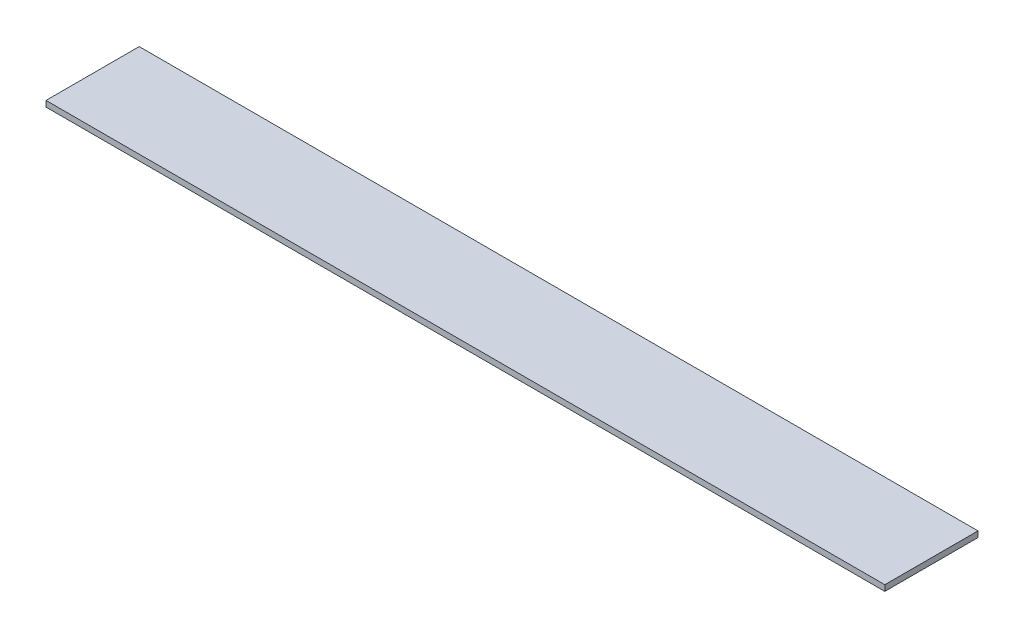
ISO-10303-21;
HEADER;
FILE_DESCRIPTION(('STEP AP214'),'2;1');
FILE_NAME('part.step','',(''),(''),'','','');
FILE_SCHEMA(('AUTOMOTIVE_DESIGN { 1 0 10303 214 1 1 1 1 }'));
ENDSEC;
DATA;
#1=APPLICATION_CONTEXT('core data for automotive mechanical design processes');
#2=APPLICATION_PROTOCOL_DEFINITION('international standard','automotive_design',2000,#1);
#3=PRODUCT_CONTEXT('',#1,'mechanical');
#4=PRODUCT('Part','Part','',(#3));
#5=PRODUCT_RELATED_PRODUCT_CATEGORY('part','',(#4));
#6=PRODUCT_DEFINITION_FORMATION('','',#4);
#7=PRODUCT_DEFINITION_CONTEXT('part definition',#1,'design');
#8=PRODUCT_DEFINITION('design','',#6,#7);
#9=PRODUCT_DEFINITION_SHAPE('','',#8);
#10=(LENGTH_UNIT() NAMED_UNIT(*) SI_UNIT(.MILLI.,.METRE.));
#11=(NAMED_UNIT(*) PLANE_ANGLE_UNIT() SI_UNIT($,.RADIAN.));
#12=(NAMED_UNIT(*) SI_UNIT($,.STERADIAN.) SOLID_ANGLE_UNIT());
#13=UNCERTAINTY_MEASURE_WITH_UNIT(LENGTH_MEASURE(1.E-05),#10,'distance_accuracy_value','');
#14=(GEOMETRIC_REPRESENTATION_CONTEXT(3) GLOBAL_UNCERTAINTY_ASSIGNED_CONTEXT((#13)) GLOBAL_UNIT_ASSIGNED_CONTEXT((#10,
#11,#12)) REPRESENTATION_CONTEXT('',''));
#15=CARTESIAN_POINT('',(0.,0.,0.));
#16=DIRECTION('',(0.,0.,1.));
#17=DIRECTION('',(1.,0.,0.));
#18=AXIS2_PLACEMENT_3D('',#15,#16,#17);
#19=CARTESIAN_POINT('',(0.,1.5875,0.));
#20=DIRECTION('',(1.,0.,0.));
#21=DIRECTION('',(0.,0.,-1.));
#22=AXIS2_PLACEMENT_3D('',#19,#20,#21);
#23=PLANE('',#22);
#24=DIRECTION('',(0.,0.,1.));
#25=VECTOR('',#24,1.);
#26=CARTESIAN_POINT('',(0.,0.,0.));
#27=LINE('',#26,#25);
#28=CARTESIAN_POINT('',(0.,0.,-25.4));
#29=VERTEX_POINT('',#28);
#30=CARTESIAN_POINT('',(0.,0.,0.));
#31=VERTEX_POINT('',#30);
#32=EDGE_CURVE('E100',#29,#31,#27,.T.);
#33=ORIENTED_EDGE('',*,*,#32,.T.);
#34=DIRECTION('',(0.,-1.,0.));
#35=VECTOR('',#34,1.);
#36=CARTESIAN_POINT('',(0.,1.5875,0.));
#37=LINE('',#36,#35);
#38=CARTESIAN_POINT('',(0.,1.5875,0.));
#39=VERTEX_POINT('',#38);
#40=EDGE_CURVE('E11',#39,#31,#37,.T.);
#41=ORIENTED_EDGE('',*,*,#40,.F.);
#42=DIRECTION('',(0.,0.,1.));
#43=VECTOR('',#42,1.);
#44=CARTESIAN_POINT('',(0.,1.5875,0.));
#45=LINE('',#44,#43);
#46=CARTESIAN_POINT('',(0.,1.5875,-25.4));
#47=VERTEX_POINT('',#46);
#48=EDGE_CURVE('E88',#47,#39,#45,.T.);
#49=ORIENTED_EDGE('',*,*,#48,.F.);
#50=DIRECTION('',(0.,-1.,0.));
#51=VECTOR('',#50,1.);
#52=CARTESIAN_POINT('',(0.,1.5875,-25.4));
#53=LINE('',#52,#51);
#54=EDGE_CURVE('E96',#47,#29,#53,.T.);
#55=ORIENTED_EDGE('',*,*,#54,.T.);
#56=EDGE_LOOP('',(#33,#41,#49,#55));
#57=FACE_BOUND('',#56,.T.);
#58=ADVANCED_FACE('F37',(#57),#23,.F.);
#59=CARTESIAN_POINT('',(0.,1.5875,0.));
#60=DIRECTION('',(0.,0.,-1.));
#61=DIRECTION('',(-1.,0.,0.));
#62=AXIS2_PLACEMENT_3D('',#59,#60,#61);
#63=PLANE('',#62);
#64=DIRECTION('',(1.,0.,0.));
#65=VECTOR('',#64,1.);
#66=CARTESIAN_POINT('',(0.,0.,0.));
#67=LINE('',#66,#65);
#68=CARTESIAN_POINT('',(228.6,0.,0.));
#69=VERTEX_POINT('',#68);
#70=EDGE_CURVE('E92',#31,#69,#67,.T.);
#71=ORIENTED_EDGE('',*,*,#70,.T.);
#72=DIRECTION('',(0.,-1.,0.));
#73=VECTOR('',#72,1.);
#74=CARTESIAN_POINT('',(228.6,1.5875,0.));
#75=LINE('',#74,#73);
#76=CARTESIAN_POINT('',(228.6,1.5875,0.));
#77=VERTEX_POINT('',#76);
#78=EDGE_CURVE('E45',#77,#69,#75,.T.);
#79=ORIENTED_EDGE('',*,*,#78,.F.);
#80=DIRECTION('',(1.,0.,0.));
#81=VECTOR('',#80,1.);
#82=CARTESIAN_POINT('',(0.,1.5875,0.));
#83=LINE('',#82,#81);
#84=EDGE_CURVE('E83',#39,#77,#83,.T.);
#85=ORIENTED_EDGE('',*,*,#84,.F.);
#86=ORIENTED_EDGE('',*,*,#40,.T.);
#87=EDGE_LOOP('',(#71,#79,#85,#86));
#88=FACE_BOUND('',#87,.T.);
#89=ADVANCED_FACE('F91',(#88),#63,.F.);
#90=CARTESIAN_POINT('',(228.6,1.5875,0.));
#91=DIRECTION('',(-1.,0.,0.));
#92=DIRECTION('',(0.,0.,1.));
#93=AXIS2_PLACEMENT_3D('',#90,#91,#92);
#94=PLANE('',#93);
#95=DIRECTION('',(0.,0.,-1.));
#96=VECTOR('',#95,1.);
#97=CARTESIAN_POINT('',(228.6,0.,0.));
#98=LINE('',#97,#96);
#99=CARTESIAN_POINT('',(228.6,0.,-25.4));
#100=VERTEX_POINT('',#99);
#101=EDGE_CURVE('E70',#69,#100,#98,.T.);
#102=ORIENTED_EDGE('',*,*,#101,.T.);
#103=DIRECTION('',(0.,-1.,0.));
#104=VECTOR('',#103,1.);
#105=CARTESIAN_POINT('',(228.6,1.5875,-25.4));
#106=LINE('',#105,#104);
#107=CARTESIAN_POINT('',(228.6,1.5875,-25.4));
#108=VERTEX_POINT('',#107);
#109=EDGE_CURVE('E93',#108,#100,#106,.T.);
#110=ORIENTED_EDGE('',*,*,#109,.F.);
#111=DIRECTION('',(0.,0.,-1.));
#112=VECTOR('',#111,1.);
#113=CARTESIAN_POINT('',(228.6,1.5875,0.));
#114=LINE('',#113,#112);
#115=EDGE_CURVE('E86',#77,#108,#114,.T.);
#116=ORIENTED_EDGE('',*,*,#115,.F.);
#117=ORIENTED_EDGE('',*,*,#78,.T.);
#118=EDGE_LOOP('',(#102,#110,#116,#117));
#119=FACE_BOUND('',#118,.T.);
#120=ADVANCED_FACE('F94',(#119),#94,.F.);
#121=CARTESIAN_POINT('',(0.,1.5875,-25.4));
#122=DIRECTION('',(0.,0.,1.));
#123=DIRECTION('',(1.,0.,0.));
#124=AXIS2_PLACEMENT_3D('',#121,#122,#123);
#125=PLANE('',#124);
#126=DIRECTION('',(-1.,0.,0.));
#127=VECTOR('',#126,1.);
#128=CARTESIAN_POINT('',(0.,0.,-25.4));
#129=LINE('',#128,#127);
#130=EDGE_CURVE('E76',#100,#29,#129,.T.);
#131=ORIENTED_EDGE('',*,*,#130,.T.);
#132=ORIENTED_EDGE('',*,*,#54,.F.);
#133=DIRECTION('',(-1.,0.,0.));
#134=VECTOR('',#133,1.);
#135=CARTESIAN_POINT('',(0.,1.5875,-25.4));
#136=LINE('',#135,#134);
#137=EDGE_CURVE('E53',#108,#47,#136,.T.);
#138=ORIENTED_EDGE('',*,*,#137,.F.);
#139=ORIENTED_EDGE('',*,*,#109,.T.);
#140=EDGE_LOOP('',(#131,#132,#138,#139));
#141=FACE_BOUND('',#140,.T.);
#142=ADVANCED_FACE('F107',(#141),#125,.F.);
#143=CARTESIAN_POINT('',(0.,1.5875,0.));
#144=DIRECTION('',(0.,-1.,0.));
#145=DIRECTION('',(0.,0.,-1.));
#146=AXIS2_PLACEMENT_3D('',#143,#144,#145);
#147=PLANE('',#146);
#148=ORIENTED_EDGE('',*,*,#48,.T.);
#149=ORIENTED_EDGE('',*,*,#84,.T.);
#150=ORIENTED_EDGE('',*,*,#115,.T.);
#151=ORIENTED_EDGE('',*,*,#137,.T.);
#152=EDGE_LOOP('',(#148,#149,#150,#151));
#153=FACE_BOUND('',#152,.T.);
#154=ADVANCED_FACE('F84',(#153),#147,.F.);
#155=CARTESIAN_POINT('',(0.,0.,0.));
#156=DIRECTION('',(0.,-1.,0.));
#157=DIRECTION('',(0.,0.,-1.));
#158=AXIS2_PLACEMENT_3D('',#155,#156,#157);
#159=PLANE('',#158);
#160=ORIENTED_EDGE('',*,*,#32,.F.);
#161=ORIENTED_EDGE('',*,*,#130,.F.);
#162=ORIENTED_EDGE('',*,*,#101,.F.);
#163=ORIENTED_EDGE('',*,*,#70,.F.);
#164=EDGE_LOOP('',(#160,#161,#162,#163));
#165=FACE_BOUND('',#164,.T.);
#166=ADVANCED_FACE('F110',(#165),#159,.T.);
#167=CLOSED_SHELL('',(#58,#89,#120,#142,#154,#166));
#168=MANIFOLD_SOLID_BREP('B2',#167);
#169=ADVANCED_BREP_SHAPE_REPRESENTATION('',(#18,#168),#14);
#170=SHAPE_DEFINITION_REPRESENTATION(#9,#169);
ENDSEC;
END-ISO-10303-21;
